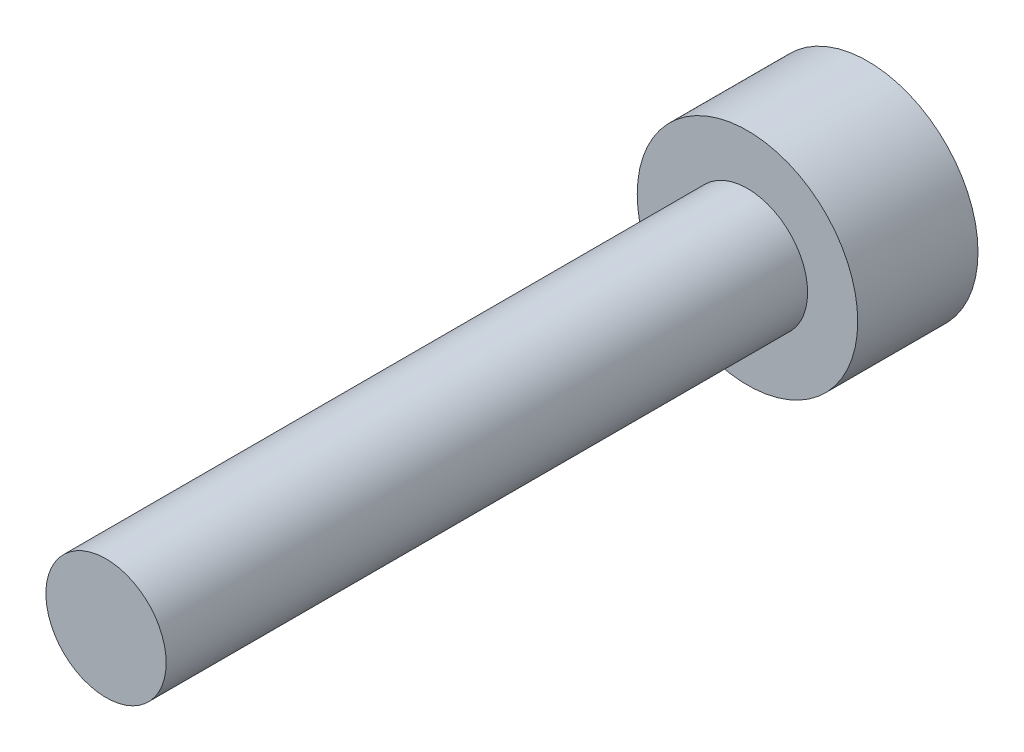
ISO-10303-21;
HEADER;
FILE_DESCRIPTION(('STEP AP214'),'2;1');
FILE_NAME('part.step','',(''),(''),'','','');
FILE_SCHEMA(('AUTOMOTIVE_DESIGN { 1 0 10303 214 1 1 1 1 }'));
ENDSEC;
DATA;
#1=APPLICATION_CONTEXT('core data for automotive mechanical design processes');
#2=APPLICATION_PROTOCOL_DEFINITION('international standard','automotive_design',2000,#1);
#3=PRODUCT_CONTEXT('',#1,'mechanical');
#4=PRODUCT('Part','Part','',(#3));
#5=PRODUCT_RELATED_PRODUCT_CATEGORY('part','',(#4));
#6=PRODUCT_DEFINITION_FORMATION('','',#4);
#7=PRODUCT_DEFINITION_CONTEXT('part definition',#1,'design');
#8=PRODUCT_DEFINITION('design','',#6,#7);
#9=PRODUCT_DEFINITION_SHAPE('','',#8);
#10=(LENGTH_UNIT() NAMED_UNIT(*) SI_UNIT(.MILLI.,.METRE.));
#11=(NAMED_UNIT(*) PLANE_ANGLE_UNIT() SI_UNIT($,.RADIAN.));
#12=(NAMED_UNIT(*) SI_UNIT($,.STERADIAN.) SOLID_ANGLE_UNIT());
#13=UNCERTAINTY_MEASURE_WITH_UNIT(LENGTH_MEASURE(1.E-05),#10,'distance_accuracy_value','');
#14=(GEOMETRIC_REPRESENTATION_CONTEXT(3) GLOBAL_UNCERTAINTY_ASSIGNED_CONTEXT((#13)) GLOBAL_UNIT_ASSIGNED_CONTEXT((#10,
#11,#12)) REPRESENTATION_CONTEXT('',''));
#15=CARTESIAN_POINT('',(0.,0.,0.));
#16=DIRECTION('',(0.,0.,1.));
#17=DIRECTION('',(1.,0.,0.));
#18=AXIS2_PLACEMENT_3D('',#15,#16,#17);
#19=CARTESIAN_POINT('',(0.,0.,0.));
#20=DIRECTION('',(0.,0.,-1.));
#21=DIRECTION('',(-1.,0.,0.));
#22=AXIS2_PLACEMENT_3D('',#19,#20,#21);
#23=PLANE('',#22);
#24=DIRECTION('',(-0.5,0.866025403784439,0.));
#25=VECTOR('',#24,1.);
#26=CARTESIAN_POINT('',(-0.866025403784439,-1.5,0.));
#27=LINE('',#26,#25);
#28=CARTESIAN_POINT('',(-0.866025403784439,-1.5,0.));
#29=VERTEX_POINT('',#28);
#30=CARTESIAN_POINT('',(-1.73205080756888,0.,0.));
#31=VERTEX_POINT('',#30);
#32=EDGE_CURVE('E47',#29,#31,#27,.T.);
#33=ORIENTED_EDGE('',*,*,#32,.F.);
#34=DIRECTION('',(-1.,0.,0.));
#35=VECTOR('',#34,1.);
#36=CARTESIAN_POINT('',(0.866025403784438,-1.5,0.));
#37=LINE('',#36,#35);
#38=CARTESIAN_POINT('',(0.866025403784438,-1.5,0.));
#39=VERTEX_POINT('',#38);
#40=EDGE_CURVE('E130',#39,#29,#37,.T.);
#41=ORIENTED_EDGE('',*,*,#40,.F.);
#42=DIRECTION('',(-0.5,-0.866025403784439,0.));
#43=VECTOR('',#42,1.);
#44=CARTESIAN_POINT('',(1.73205080756888,0.,0.));
#45=LINE('',#44,#43);
#46=CARTESIAN_POINT('',(1.73205080756888,0.,0.));
#47=VERTEX_POINT('',#46);
#48=EDGE_CURVE('E128',#47,#39,#45,.T.);
#49=ORIENTED_EDGE('',*,*,#48,.F.);
#50=DIRECTION('',(0.5,-0.866025403784439,0.));
#51=VECTOR('',#50,1.);
#52=CARTESIAN_POINT('',(0.866025403784439,1.5,0.));
#53=LINE('',#52,#51);
#54=CARTESIAN_POINT('',(0.866025403784439,1.5,0.));
#55=VERTEX_POINT('',#54);
#56=EDGE_CURVE('E95',#55,#47,#53,.T.);
#57=ORIENTED_EDGE('',*,*,#56,.F.);
#58=DIRECTION('',(1.,0.,0.));
#59=VECTOR('',#58,1.);
#60=CARTESIAN_POINT('',(-0.866025403784438,1.5,0.));
#61=LINE('',#60,#59);
#62=CARTESIAN_POINT('',(-0.866025403784438,1.5,0.));
#63=VERTEX_POINT('',#62);
#64=EDGE_CURVE('E124',#63,#55,#61,.T.);
#65=ORIENTED_EDGE('',*,*,#64,.F.);
#66=DIRECTION('',(0.5,0.866025403784438,0.));
#67=VECTOR('',#66,1.);
#68=CARTESIAN_POINT('',(-1.73205080756888,0.,0.));
#69=LINE('',#68,#67);
#70=EDGE_CURVE('E121',#31,#63,#69,.T.);
#71=ORIENTED_EDGE('',*,*,#70,.F.);
#72=EDGE_LOOP('',(#33,#41,#49,#57,#65,#71));
#73=FACE_BOUND('',#72,.T.);
#74=CARTESIAN_POINT('',(0.,0.,0.));
#75=DIRECTION('',(0.,0.,1.));
#76=DIRECTION('',(1.,0.,0.));
#77=AXIS2_PLACEMENT_3D('',#74,#75,#76);
#78=CIRCLE('',#77,2.75);
#79=CARTESIAN_POINT('',(2.75,0.,0.));
#80=VERTEX_POINT('',#79);
#81=EDGE_CURVE('E11',#80,#80,#78,.T.);
#82=ORIENTED_EDGE('',*,*,#81,.F.);
#83=EDGE_LOOP('',(#82));
#84=FACE_BOUND('',#83,.T.);
#85=ADVANCED_FACE('F33',(#73,#84),#23,.T.);
#86=CARTESIAN_POINT('',(0.,0.,3.));
#87=DIRECTION('',(0.,0.,1.));
#88=DIRECTION('',(1.,0.,0.));
#89=AXIS2_PLACEMENT_3D('',#86,#87,#88);
#90=CYLINDRICAL_SURFACE('',#89,2.75);
#91=ORIENTED_EDGE('',*,*,#81,.T.);
#92=EDGE_LOOP('',(#91));
#93=FACE_BOUND('',#92,.T.);
#94=CARTESIAN_POINT('',(0.,0.,3.));
#95=DIRECTION('',(0.,0.,1.));
#96=DIRECTION('',(1.,0.,0.));
#97=AXIS2_PLACEMENT_3D('',#94,#95,#96);
#98=CIRCLE('',#97,2.75);
#99=CARTESIAN_POINT('',(2.75,0.,3.));
#100=VERTEX_POINT('',#99);
#101=EDGE_CURVE('E40',#100,#100,#98,.T.);
#102=ORIENTED_EDGE('',*,*,#101,.F.);
#103=EDGE_LOOP('',(#102));
#104=FACE_BOUND('',#103,.T.);
#105=ADVANCED_FACE('F150',(#93,#104),#90,.T.);
#106=CARTESIAN_POINT('',(2.75,0.,3.));
#107=DIRECTION('',(0.,0.,1.));
#108=DIRECTION('',(1.,0.,0.));
#109=AXIS2_PLACEMENT_3D('',#106,#107,#108);
#110=PLANE('',#109);
#111=ORIENTED_EDGE('',*,*,#101,.T.);
#112=EDGE_LOOP('',(#111));
#113=FACE_BOUND('',#112,.T.);
#114=CARTESIAN_POINT('',(0.,0.,3.));
#115=DIRECTION('',(0.,0.,1.));
#116=DIRECTION('',(1.,0.,0.));
#117=AXIS2_PLACEMENT_3D('',#114,#115,#116);
#118=CIRCLE('',#117,1.5);
#119=CARTESIAN_POINT('',(1.5,0.,3.));
#120=VERTEX_POINT('',#119);
#121=EDGE_CURVE('E142',#120,#120,#118,.T.);
#122=ORIENTED_EDGE('',*,*,#121,.F.);
#123=EDGE_LOOP('',(#122));
#124=FACE_BOUND('',#123,.T.);
#125=ADVANCED_FACE('F147',(#113,#124),#110,.T.);
#126=CARTESIAN_POINT('',(0.,0.,3.));
#127=DIRECTION('',(0.,0.,1.));
#128=DIRECTION('',(1.,0.,0.));
#129=AXIS2_PLACEMENT_3D('',#126,#127,#128);
#130=CYLINDRICAL_SURFACE('',#129,1.5);
#131=ORIENTED_EDGE('',*,*,#121,.T.);
#132=EDGE_LOOP('',(#131));
#133=FACE_BOUND('',#132,.T.);
#134=CARTESIAN_POINT('',(0.,0.,19.));
#135=DIRECTION('',(0.,0.,1.));
#136=DIRECTION('',(1.,0.,0.));
#137=AXIS2_PLACEMENT_3D('',#134,#135,#136);
#138=CIRCLE('',#137,1.5);
#139=CARTESIAN_POINT('',(1.5,0.,19.));
#140=VERTEX_POINT('',#139);
#141=EDGE_CURVE('E134',#140,#140,#138,.T.);
#142=ORIENTED_EDGE('',*,*,#141,.F.);
#143=EDGE_LOOP('',(#142));
#144=FACE_BOUND('',#143,.T.);
#145=ADVANCED_FACE('F157',(#133,#144),#130,.T.);
#146=CARTESIAN_POINT('',(1.5,0.,19.));
#147=DIRECTION('',(0.,0.,1.));
#148=DIRECTION('',(1.,0.,0.));
#149=AXIS2_PLACEMENT_3D('',#146,#147,#148);
#150=PLANE('',#149);
#151=ORIENTED_EDGE('',*,*,#141,.T.);
#152=EDGE_LOOP('',(#151));
#153=FACE_BOUND('',#152,.T.);
#154=ADVANCED_FACE('F163',(#153),#150,.T.);
#155=CARTESIAN_POINT('',(-0.866025403784439,-1.5,1.5));
#156=DIRECTION('',(-0.866025403784439,-0.5,0.));
#157=DIRECTION('',(0.5,-0.866025403784439,0.));
#158=AXIS2_PLACEMENT_3D('',#155,#156,#157);
#159=PLANE('',#158);
#160=ORIENTED_EDGE('',*,*,#32,.T.);
#161=DIRECTION('',(0.,0.,-1.));
#162=VECTOR('',#161,1.);
#163=CARTESIAN_POINT('',(-1.73205080756888,0.,1.5));
#164=LINE('',#163,#162);
#165=CARTESIAN_POINT('',(-1.73205080756888,0.,1.5));
#166=VERTEX_POINT('',#165);
#167=EDGE_CURVE('E77',#166,#31,#164,.T.);
#168=ORIENTED_EDGE('',*,*,#167,.F.);
#169=DIRECTION('',(-0.5,0.866025403784439,0.));
#170=VECTOR('',#169,1.);
#171=CARTESIAN_POINT('',(-0.866025403784439,-1.5,1.5));
#172=LINE('',#171,#170);
#173=CARTESIAN_POINT('',(-0.866025403784439,-1.5,1.5));
#174=VERTEX_POINT('',#173);
#175=EDGE_CURVE('E132',#174,#166,#172,.T.);
#176=ORIENTED_EDGE('',*,*,#175,.F.);
#177=DIRECTION('',(0.,0.,-1.));
#178=VECTOR('',#177,1.);
#179=CARTESIAN_POINT('',(-0.866025403784439,-1.5,1.5));
#180=LINE('',#179,#178);
#181=EDGE_CURVE('E55',#174,#29,#180,.T.);
#182=ORIENTED_EDGE('',*,*,#181,.T.);
#183=EDGE_LOOP('',(#160,#168,#176,#182));
#184=FACE_BOUND('',#183,.T.);
#185=ADVANCED_FACE('F167',(#184),#159,.F.);
#186=CARTESIAN_POINT('',(0.866025403784438,-1.5,1.5));
#187=DIRECTION('',(0.,-1.,0.));
#188=DIRECTION('',(1.,0.,0.));
#189=AXIS2_PLACEMENT_3D('',#186,#187,#188);
#190=PLANE('',#189);
#191=ORIENTED_EDGE('',*,*,#40,.T.);
#192=ORIENTED_EDGE('',*,*,#181,.F.);
#193=DIRECTION('',(-1.,0.,0.));
#194=VECTOR('',#193,1.);
#195=CARTESIAN_POINT('',(0.866025403784438,-1.5,1.5));
#196=LINE('',#195,#194);
#197=CARTESIAN_POINT('',(0.866025403784438,-1.5,1.5));
#198=VERTEX_POINT('',#197);
#199=EDGE_CURVE('E107',#198,#174,#196,.T.);
#200=ORIENTED_EDGE('',*,*,#199,.F.);
#201=DIRECTION('',(0.,0.,-1.));
#202=VECTOR('',#201,1.);
#203=CARTESIAN_POINT('',(0.866025403784438,-1.5,1.5));
#204=LINE('',#203,#202);
#205=EDGE_CURVE('E99',#198,#39,#204,.T.);
#206=ORIENTED_EDGE('',*,*,#205,.T.);
#207=EDGE_LOOP('',(#191,#192,#200,#206));
#208=FACE_BOUND('',#207,.T.);
#209=ADVANCED_FACE('F171',(#208),#190,.F.);
#210=CARTESIAN_POINT('',(1.73205080756888,0.,1.5));
#211=DIRECTION('',(0.866025403784438,-0.5,0.));
#212=DIRECTION('',(0.5,0.866025403784439,0.));
#213=AXIS2_PLACEMENT_3D('',#210,#211,#212);
#214=PLANE('',#213);
#215=ORIENTED_EDGE('',*,*,#48,.T.);
#216=ORIENTED_EDGE('',*,*,#205,.F.);
#217=DIRECTION('',(-0.5,-0.866025403784439,0.));
#218=VECTOR('',#217,1.);
#219=CARTESIAN_POINT('',(1.73205080756888,0.,1.5));
#220=LINE('',#219,#218);
#221=CARTESIAN_POINT('',(1.73205080756888,0.,1.5));
#222=VERTEX_POINT('',#221);
#223=EDGE_CURVE('E103',#222,#198,#220,.T.);
#224=ORIENTED_EDGE('',*,*,#223,.F.);
#225=DIRECTION('',(0.,0.,-1.));
#226=VECTOR('',#225,1.);
#227=CARTESIAN_POINT('',(1.73205080756888,0.,1.5));
#228=LINE('',#227,#226);
#229=EDGE_CURVE('E88',#222,#47,#228,.T.);
#230=ORIENTED_EDGE('',*,*,#229,.T.);
#231=EDGE_LOOP('',(#215,#216,#224,#230));
#232=FACE_BOUND('',#231,.T.);
#233=ADVANCED_FACE('F104',(#232),#214,.F.);
#234=CARTESIAN_POINT('',(0.866025403784439,1.5,1.5));
#235=DIRECTION('',(0.866025403784439,0.5,0.));
#236=DIRECTION('',(-0.5,0.866025403784439,0.));
#237=AXIS2_PLACEMENT_3D('',#234,#235,#236);
#238=PLANE('',#237);
#239=ORIENTED_EDGE('',*,*,#56,.T.);
#240=ORIENTED_EDGE('',*,*,#229,.F.);
#241=DIRECTION('',(0.5,-0.866025403784439,0.));
#242=VECTOR('',#241,1.);
#243=CARTESIAN_POINT('',(0.866025403784439,1.5,1.5));
#244=LINE('',#243,#242);
#245=CARTESIAN_POINT('',(0.866025403784439,1.5,1.5));
#246=VERTEX_POINT('',#245);
#247=EDGE_CURVE('E92',#246,#222,#244,.T.);
#248=ORIENTED_EDGE('',*,*,#247,.F.);
#249=DIRECTION('',(0.,0.,-1.));
#250=VECTOR('',#249,1.);
#251=CARTESIAN_POINT('',(0.866025403784439,1.5,1.5));
#252=LINE('',#251,#250);
#253=EDGE_CURVE('E100',#246,#55,#252,.T.);
#254=ORIENTED_EDGE('',*,*,#253,.T.);
#255=EDGE_LOOP('',(#239,#240,#248,#254));
#256=FACE_BOUND('',#255,.T.);
#257=ADVANCED_FACE('F90',(#256),#238,.F.);
#258=CARTESIAN_POINT('',(-0.866025403784438,1.5,1.5));
#259=DIRECTION('',(0.,1.,0.));
#260=DIRECTION('',(-1.,0.,0.));
#261=AXIS2_PLACEMENT_3D('',#258,#259,#260);
#262=PLANE('',#261);
#263=ORIENTED_EDGE('',*,*,#64,.T.);
#264=ORIENTED_EDGE('',*,*,#253,.F.);
#265=DIRECTION('',(1.,0.,0.));
#266=VECTOR('',#265,1.);
#267=CARTESIAN_POINT('',(-0.866025403784438,1.5,1.5));
#268=LINE('',#267,#266);
#269=CARTESIAN_POINT('',(-0.866025403784438,1.5,1.5));
#270=VERTEX_POINT('',#269);
#271=EDGE_CURVE('E113',#270,#246,#268,.T.);
#272=ORIENTED_EDGE('',*,*,#271,.F.);
#273=DIRECTION('',(0.,0.,-1.));
#274=VECTOR('',#273,1.);
#275=CARTESIAN_POINT('',(-0.866025403784438,1.5,1.5));
#276=LINE('',#275,#274);
#277=EDGE_CURVE('E137',#270,#63,#276,.T.);
#278=ORIENTED_EDGE('',*,*,#277,.T.);
#279=EDGE_LOOP('',(#263,#264,#272,#278));
#280=FACE_BOUND('',#279,.T.);
#281=ADVANCED_FACE('F175',(#280),#262,.F.);
#282=CARTESIAN_POINT('',(-1.73205080756888,0.,1.5));
#283=DIRECTION('',(-0.866025403784439,0.5,0.));
#284=DIRECTION('',(-0.5,-0.866025403784439,0.));
#285=AXIS2_PLACEMENT_3D('',#282,#283,#284);
#286=PLANE('',#285);
#287=ORIENTED_EDGE('',*,*,#70,.T.);
#288=ORIENTED_EDGE('',*,*,#277,.F.);
#289=DIRECTION('',(0.5,0.866025403784438,0.));
#290=VECTOR('',#289,1.);
#291=CARTESIAN_POINT('',(-1.73205080756888,0.,1.5));
#292=LINE('',#291,#290);
#293=EDGE_CURVE('E115',#166,#270,#292,.T.);
#294=ORIENTED_EDGE('',*,*,#293,.F.);
#295=ORIENTED_EDGE('',*,*,#167,.T.);
#296=EDGE_LOOP('',(#287,#288,#294,#295));
#297=FACE_BOUND('',#296,.T.);
#298=ADVANCED_FACE('F172',(#297),#286,.F.);
#299=CARTESIAN_POINT('',(0.,0.,1.5));
#300=DIRECTION('',(0.,0.,-1.));
#301=DIRECTION('',(-1.,0.,0.));
#302=AXIS2_PLACEMENT_3D('',#299,#300,#301);
#303=PLANE('',#302);
#304=ORIENTED_EDGE('',*,*,#175,.T.);
#305=ORIENTED_EDGE('',*,*,#293,.T.);
#306=ORIENTED_EDGE('',*,*,#271,.T.);
#307=ORIENTED_EDGE('',*,*,#247,.T.);
#308=ORIENTED_EDGE('',*,*,#223,.T.);
#309=ORIENTED_EDGE('',*,*,#199,.T.);
#310=EDGE_LOOP('',(#304,#305,#306,#307,#308,#309));
#311=FACE_BOUND('',#310,.T.);
#312=ADVANCED_FACE('F110',(#311),#303,.T.);
#313=CLOSED_SHELL('',(#85,#105,#125,#145,#154,#185,#209,#233,#257,#281,#298,#312));
#314=MANIFOLD_SOLID_BREP('B2',#313);
#315=ADVANCED_BREP_SHAPE_REPRESENTATION('',(#18,#314),#14);
#316=SHAPE_DEFINITION_REPRESENTATION(#9,#315);
ENDSEC;
END-ISO-10303-21;
